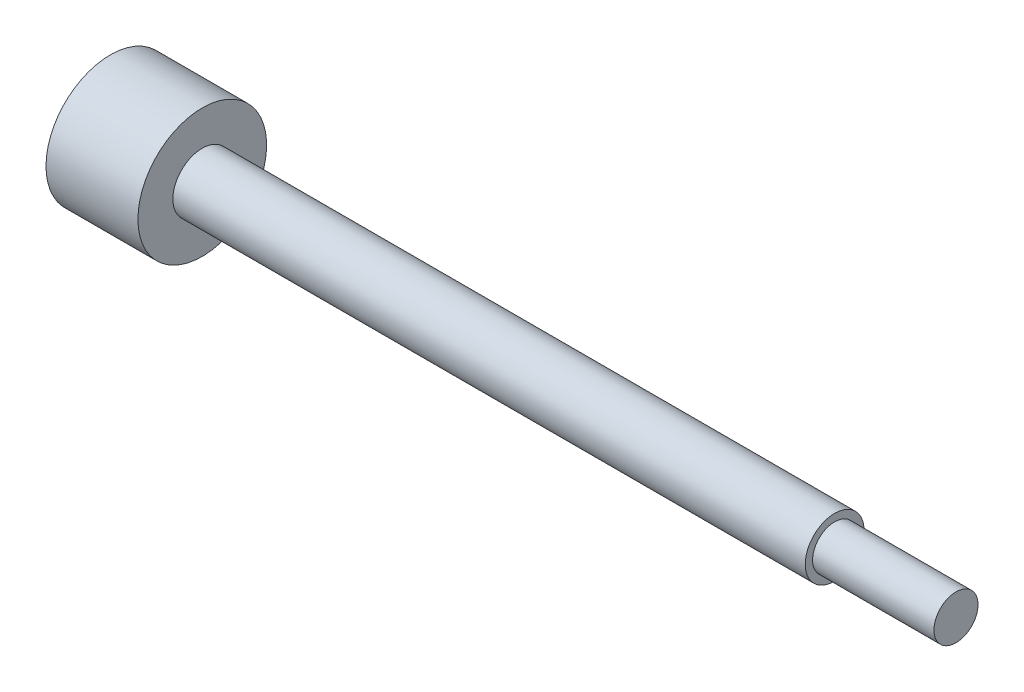
ISO-10303-21;
HEADER;
FILE_DESCRIPTION(('STEP AP214'),'2;1');
FILE_NAME('part.step','',(''),(''),'','','');
FILE_SCHEMA(('AUTOMOTIVE_DESIGN { 1 0 10303 214 1 1 1 1 }'));
ENDSEC;
DATA;
#1=APPLICATION_CONTEXT('core data for automotive mechanical design processes');
#2=APPLICATION_PROTOCOL_DEFINITION('international standard','automotive_design',2000,#1);
#3=PRODUCT_CONTEXT('',#1,'mechanical');
#4=PRODUCT('Part','Part','',(#3));
#5=PRODUCT_RELATED_PRODUCT_CATEGORY('part','',(#4));
#6=PRODUCT_DEFINITION_FORMATION('','',#4);
#7=PRODUCT_DEFINITION_CONTEXT('part definition',#1,'design');
#8=PRODUCT_DEFINITION('design','',#6,#7);
#9=PRODUCT_DEFINITION_SHAPE('','',#8);
#10=(LENGTH_UNIT() NAMED_UNIT(*) SI_UNIT(.MILLI.,.METRE.));
#11=(NAMED_UNIT(*) PLANE_ANGLE_UNIT() SI_UNIT($,.RADIAN.));
#12=(NAMED_UNIT(*) SI_UNIT($,.STERADIAN.) SOLID_ANGLE_UNIT());
#13=UNCERTAINTY_MEASURE_WITH_UNIT(LENGTH_MEASURE(1.E-05),#10,'distance_accuracy_value','');
#14=(GEOMETRIC_REPRESENTATION_CONTEXT(3) GLOBAL_UNCERTAINTY_ASSIGNED_CONTEXT((#13)) GLOBAL_UNIT_ASSIGNED_CONTEXT((#10,
#11,#12)) REPRESENTATION_CONTEXT('',''));
#15=CARTESIAN_POINT('',(0.,0.,0.));
#16=DIRECTION('',(0.,0.,1.));
#17=DIRECTION('',(1.,0.,0.));
#18=AXIS2_PLACEMENT_3D('',#15,#16,#17);
#19=CARTESIAN_POINT('',(0.,0.,0.));
#20=DIRECTION('',(1.,0.,0.));
#21=DIRECTION('',(0.,0.,-1.));
#22=AXIS2_PLACEMENT_3D('',#19,#20,#21);
#23=PLANE('',#22);
#24=CARTESIAN_POINT('',(0.,0.,0.));
#25=DIRECTION('',(-1.,0.,0.));
#26=DIRECTION('',(0.,0.,1.));
#27=AXIS2_PLACEMENT_3D('',#24,#25,#26);
#28=CIRCLE('',#27,17.5);
#29=CARTESIAN_POINT('',(0.,0.,17.5));
#30=VERTEX_POINT('',#29);
#31=EDGE_CURVE('E10',#30,#30,#28,.T.);
#32=ORIENTED_EDGE('',*,*,#31,.T.);
#33=EDGE_LOOP('',(#32));
#34=FACE_BOUND('',#33,.T.);
#35=ADVANCED_FACE('F32',(#34),#23,.F.);
#36=CARTESIAN_POINT('',(0.,0.,0.));
#37=DIRECTION('',(-1.,0.,0.));
#38=DIRECTION('',(0.,0.,1.));
#39=AXIS2_PLACEMENT_3D('',#36,#37,#38);
#40=CYLINDRICAL_SURFACE('',#39,17.5);
#41=ORIENTED_EDGE('',*,*,#31,.F.);
#42=EDGE_LOOP('',(#41));
#43=FACE_BOUND('',#42,.T.);
#44=CARTESIAN_POINT('',(25.,0.,0.));
#45=DIRECTION('',(-1.,0.,0.));
#46=DIRECTION('',(0.,0.,1.));
#47=AXIS2_PLACEMENT_3D('',#44,#45,#46);
#48=CIRCLE('',#47,17.5);
#49=CARTESIAN_POINT('',(25.,0.,17.5));
#50=VERTEX_POINT('',#49);
#51=EDGE_CURVE('E38',#50,#50,#48,.T.);
#52=ORIENTED_EDGE('',*,*,#51,.T.);
#53=EDGE_LOOP('',(#52));
#54=FACE_BOUND('',#53,.T.);
#55=ADVANCED_FACE('F70',(#43,#54),#40,.T.);
#56=CARTESIAN_POINT('',(25.,17.5,0.));
#57=DIRECTION('',(-1.,0.,0.));
#58=DIRECTION('',(0.,0.,1.));
#59=AXIS2_PLACEMENT_3D('',#56,#57,#58);
#60=PLANE('',#59);
#61=ORIENTED_EDGE('',*,*,#51,.F.);
#62=EDGE_LOOP('',(#61));
#63=FACE_BOUND('',#62,.T.);
#64=CARTESIAN_POINT('',(25.,0.,0.));
#65=DIRECTION('',(-1.,0.,0.));
#66=DIRECTION('',(0.,0.,1.));
#67=AXIS2_PLACEMENT_3D('',#64,#65,#66);
#68=CIRCLE('',#67,8.);
#69=CARTESIAN_POINT('',(25.,0.,8.));
#70=VERTEX_POINT('',#69);
#71=EDGE_CURVE('E42',#70,#70,#68,.T.);
#72=ORIENTED_EDGE('',*,*,#71,.T.);
#73=EDGE_LOOP('',(#72));
#74=FACE_BOUND('',#73,.T.);
#75=ADVANCED_FACE('F74',(#63,#74),#60,.F.);
#76=CARTESIAN_POINT('',(0.,0.,0.));
#77=DIRECTION('',(-1.,0.,0.));
#78=DIRECTION('',(0.,0.,1.));
#79=AXIS2_PLACEMENT_3D('',#76,#77,#78);
#80=CYLINDRICAL_SURFACE('',#79,8.);
#81=ORIENTED_EDGE('',*,*,#71,.F.);
#82=EDGE_LOOP('',(#81));
#83=FACE_BOUND('',#82,.T.);
#84=CARTESIAN_POINT('',(197.,0.,0.));
#85=DIRECTION('',(-1.,0.,0.));
#86=DIRECTION('',(0.,0.,1.));
#87=AXIS2_PLACEMENT_3D('',#84,#85,#86);
#88=CIRCLE('',#87,8.);
#89=CARTESIAN_POINT('',(197.,0.,8.));
#90=VERTEX_POINT('',#89);
#91=EDGE_CURVE('E46',#90,#90,#88,.T.);
#92=ORIENTED_EDGE('',*,*,#91,.T.);
#93=EDGE_LOOP('',(#92));
#94=FACE_BOUND('',#93,.T.);
#95=ADVANCED_FACE('F79',(#83,#94),#80,.T.);
#96=CARTESIAN_POINT('',(197.,8.,0.));
#97=DIRECTION('',(-1.,0.,0.));
#98=DIRECTION('',(0.,0.,1.));
#99=AXIS2_PLACEMENT_3D('',#96,#97,#98);
#100=PLANE('',#99);
#101=ORIENTED_EDGE('',*,*,#91,.F.);
#102=EDGE_LOOP('',(#101));
#103=FACE_BOUND('',#102,.T.);
#104=CARTESIAN_POINT('',(197.,0.,0.));
#105=DIRECTION('',(-1.,0.,0.));
#106=DIRECTION('',(0.,0.,1.));
#107=AXIS2_PLACEMENT_3D('',#104,#105,#106);
#108=CIRCLE('',#107,6.);
#109=CARTESIAN_POINT('',(197.,0.,6.));
#110=VERTEX_POINT('',#109);
#111=EDGE_CURVE('E51',#110,#110,#108,.T.);
#112=ORIENTED_EDGE('',*,*,#111,.T.);
#113=EDGE_LOOP('',(#112));
#114=FACE_BOUND('',#113,.T.);
#115=ADVANCED_FACE('F66',(#103,#114),#100,.F.);
#116=CARTESIAN_POINT('',(0.,0.,0.));
#117=DIRECTION('',(-1.,0.,0.));
#118=DIRECTION('',(0.,0.,1.));
#119=AXIS2_PLACEMENT_3D('',#116,#117,#118);
#120=CYLINDRICAL_SURFACE('',#119,6.);
#121=ORIENTED_EDGE('',*,*,#111,.F.);
#122=EDGE_LOOP('',(#121));
#123=FACE_BOUND('',#122,.T.);
#124=CARTESIAN_POINT('',(230.,0.,0.));
#125=DIRECTION('',(-1.,0.,0.));
#126=DIRECTION('',(0.,0.,1.));
#127=AXIS2_PLACEMENT_3D('',#124,#125,#126);
#128=CIRCLE('',#127,6.);
#129=CARTESIAN_POINT('',(230.,0.,6.));
#130=VERTEX_POINT('',#129);
#131=EDGE_CURVE('E54',#130,#130,#128,.T.);
#132=ORIENTED_EDGE('',*,*,#131,.T.);
#133=EDGE_LOOP('',(#132));
#134=FACE_BOUND('',#133,.T.);
#135=ADVANCED_FACE('F58',(#123,#134),#120,.T.);
#136=CARTESIAN_POINT('',(230.,6.,0.));
#137=DIRECTION('',(-1.,0.,0.));
#138=DIRECTION('',(0.,0.,1.));
#139=AXIS2_PLACEMENT_3D('',#136,#137,#138);
#140=PLANE('',#139);
#141=ORIENTED_EDGE('',*,*,#131,.F.);
#142=EDGE_LOOP('',(#141));
#143=FACE_BOUND('',#142,.T.);
#144=ADVANCED_FACE('F60',(#143),#140,.F.);
#145=CLOSED_SHELL('',(#35,#55,#75,#95,#115,#135,#144));
#146=MANIFOLD_SOLID_BREP('B2',#145);
#147=ADVANCED_BREP_SHAPE_REPRESENTATION('',(#18,#146),#14);
#148=SHAPE_DEFINITION_REPRESENTATION(#9,#147);
ENDSEC;
END-ISO-10303-21;
